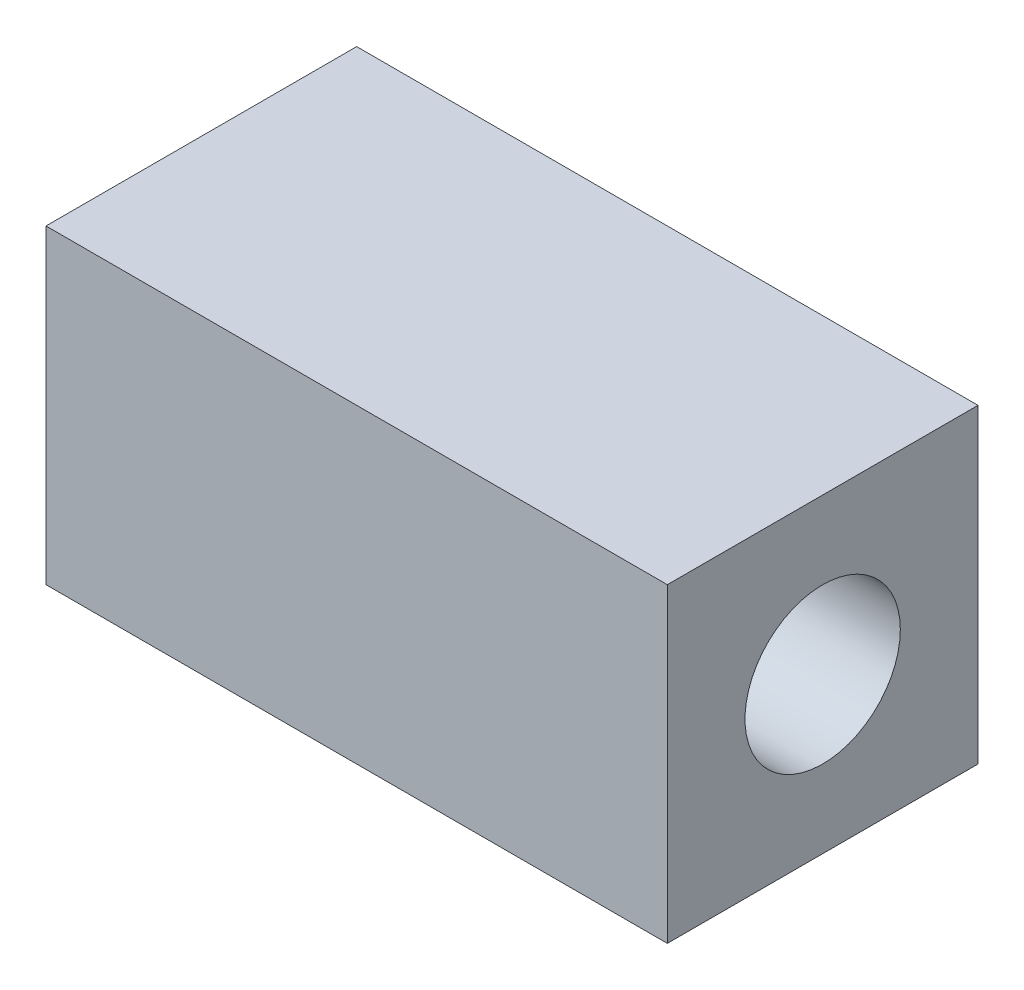
ISO-10303-21;
HEADER;
FILE_DESCRIPTION(('STEP AP214'),'2;1');
FILE_NAME('part.step','',(''),(''),'','','');
FILE_SCHEMA(('AUTOMOTIVE_DESIGN { 1 0 10303 214 1 1 1 1 }'));
ENDSEC;
DATA;
#1=APPLICATION_CONTEXT('core data for automotive mechanical design processes');
#2=APPLICATION_PROTOCOL_DEFINITION('international standard','automotive_design',2000,#1);
#3=PRODUCT_CONTEXT('',#1,'mechanical');
#4=PRODUCT('Part','Part','',(#3));
#5=PRODUCT_RELATED_PRODUCT_CATEGORY('part','',(#4));
#6=PRODUCT_DEFINITION_FORMATION('','',#4);
#7=PRODUCT_DEFINITION_CONTEXT('part definition',#1,'design');
#8=PRODUCT_DEFINITION('design','',#6,#7);
#9=PRODUCT_DEFINITION_SHAPE('','',#8);
#10=(LENGTH_UNIT() NAMED_UNIT(*) SI_UNIT(.MILLI.,.METRE.));
#11=(NAMED_UNIT(*) PLANE_ANGLE_UNIT() SI_UNIT($,.RADIAN.));
#12=(NAMED_UNIT(*) SI_UNIT($,.STERADIAN.) SOLID_ANGLE_UNIT());
#13=UNCERTAINTY_MEASURE_WITH_UNIT(LENGTH_MEASURE(1.E-05),#10,'distance_accuracy_value','');
#14=(GEOMETRIC_REPRESENTATION_CONTEXT(3) GLOBAL_UNCERTAINTY_ASSIGNED_CONTEXT((#13)) GLOBAL_UNIT_ASSIGNED_CONTEXT((#10,
#11,#12)) REPRESENTATION_CONTEXT('',''));
#15=CARTESIAN_POINT('',(0.,0.,0.));
#16=DIRECTION('',(0.,0.,1.));
#17=DIRECTION('',(1.,0.,0.));
#18=AXIS2_PLACEMENT_3D('',#15,#16,#17);
#19=CARTESIAN_POINT('',(40.,0.,0.));
#20=DIRECTION('',(-1.,0.,0.));
#21=DIRECTION('',(0.,0.,1.));
#22=AXIS2_PLACEMENT_3D('',#19,#20,#21);
#23=PLANE('',#22);
#24=DIRECTION('',(0.,-1.,0.));
#25=VECTOR('',#24,1.);
#26=CARTESIAN_POINT('',(40.,0.,0.));
#27=LINE('',#26,#25);
#28=CARTESIAN_POINT('',(40.,20.,0.));
#29=VERTEX_POINT('',#28);
#30=CARTESIAN_POINT('',(40.,0.,0.));
#31=VERTEX_POINT('',#30);
#32=EDGE_CURVE('E84',#29,#31,#27,.T.);
#33=ORIENTED_EDGE('',*,*,#32,.T.);
#34=DIRECTION('',(0.,0.,-1.));
#35=VECTOR('',#34,1.);
#36=CARTESIAN_POINT('',(40.,0.,0.));
#37=LINE('',#36,#35);
#38=CARTESIAN_POINT('',(40.,0.,-20.));
#39=VERTEX_POINT('',#38);
#40=EDGE_CURVE('E79',#31,#39,#37,.T.);
#41=ORIENTED_EDGE('',*,*,#40,.T.);
#42=DIRECTION('',(0.,1.,0.));
#43=VECTOR('',#42,1.);
#44=CARTESIAN_POINT('',(40.,0.,-20.));
#45=LINE('',#44,#43);
#46=CARTESIAN_POINT('',(40.,20.,-20.));
#47=VERTEX_POINT('',#46);
#48=EDGE_CURVE('E82',#39,#47,#45,.T.);
#49=ORIENTED_EDGE('',*,*,#48,.T.);
#50=DIRECTION('',(0.,0.,1.));
#51=VECTOR('',#50,1.);
#52=CARTESIAN_POINT('',(40.,20.,0.));
#53=LINE('',#52,#51);
#54=EDGE_CURVE('E49',#47,#29,#53,.T.);
#55=ORIENTED_EDGE('',*,*,#54,.T.);
#56=EDGE_LOOP('',(#33,#41,#49,#55));
#57=FACE_BOUND('',#56,.T.);
#58=CARTESIAN_POINT('',(40.,10.,-10.));
#59=DIRECTION('',(1.,0.,0.));
#60=DIRECTION('',(0.,0.,-1.));
#61=AXIS2_PLACEMENT_3D('',#58,#59,#60);
#62=CIRCLE('',#61,5.);
#63=CARTESIAN_POINT('',(40.,10.,-15.));
#64=VERTEX_POINT('',#63);
#65=EDGE_CURVE('E99',#64,#64,#62,.T.);
#66=ORIENTED_EDGE('',*,*,#65,.F.);
#67=EDGE_LOOP('',(#66));
#68=FACE_BOUND('',#67,.T.);
#69=ADVANCED_FACE('F32',(#57,#68),#23,.F.);
#70=CARTESIAN_POINT('',(0.,0.,0.));
#71=DIRECTION('',(-1.,0.,0.));
#72=DIRECTION('',(0.,0.,1.));
#73=AXIS2_PLACEMENT_3D('',#70,#71,#72);
#74=PLANE('',#73);
#75=DIRECTION('',(0.,-1.,0.));
#76=VECTOR('',#75,1.);
#77=CARTESIAN_POINT('',(0.,0.,0.));
#78=LINE('',#77,#76);
#79=CARTESIAN_POINT('',(0.,20.,0.));
#80=VERTEX_POINT('',#79);
#81=CARTESIAN_POINT('',(0.,0.,0.));
#82=VERTEX_POINT('',#81);
#83=EDGE_CURVE('E96',#80,#82,#78,.T.);
#84=ORIENTED_EDGE('',*,*,#83,.F.);
#85=DIRECTION('',(0.,0.,1.));
#86=VECTOR('',#85,1.);
#87=CARTESIAN_POINT('',(0.,20.,0.));
#88=LINE('',#87,#86);
#89=CARTESIAN_POINT('',(0.,20.,-20.));
#90=VERTEX_POINT('',#89);
#91=EDGE_CURVE('E72',#90,#80,#88,.T.);
#92=ORIENTED_EDGE('',*,*,#91,.F.);
#93=DIRECTION('',(0.,1.,0.));
#94=VECTOR('',#93,1.);
#95=CARTESIAN_POINT('',(0.,0.,-20.));
#96=LINE('',#95,#94);
#97=CARTESIAN_POINT('',(0.,0.,-20.));
#98=VERTEX_POINT('',#97);
#99=EDGE_CURVE('E66',#98,#90,#96,.T.);
#100=ORIENTED_EDGE('',*,*,#99,.F.);
#101=DIRECTION('',(0.,0.,-1.));
#102=VECTOR('',#101,1.);
#103=CARTESIAN_POINT('',(0.,0.,0.));
#104=LINE('',#103,#102);
#105=EDGE_CURVE('E88',#82,#98,#104,.T.);
#106=ORIENTED_EDGE('',*,*,#105,.F.);
#107=EDGE_LOOP('',(#84,#92,#100,#106));
#108=FACE_BOUND('',#107,.T.);
#109=CARTESIAN_POINT('',(0.,10.,-10.));
#110=DIRECTION('',(1.,0.,0.));
#111=DIRECTION('',(0.,0.,-1.));
#112=AXIS2_PLACEMENT_3D('',#109,#110,#111);
#113=CIRCLE('',#112,5.);
#114=CARTESIAN_POINT('',(0.,10.,-15.));
#115=VERTEX_POINT('',#114);
#116=EDGE_CURVE('E111',#115,#115,#113,.T.);
#117=ORIENTED_EDGE('',*,*,#116,.T.);
#118=EDGE_LOOP('',(#117));
#119=FACE_BOUND('',#118,.T.);
#120=ADVANCED_FACE('F107',(#108,#119),#74,.T.);
#121=CARTESIAN_POINT('',(40.,0.,0.));
#122=DIRECTION('',(0.,0.,-1.));
#123=DIRECTION('',(-1.,0.,0.));
#124=AXIS2_PLACEMENT_3D('',#121,#122,#123);
#125=PLANE('',#124);
#126=ORIENTED_EDGE('',*,*,#83,.T.);
#127=DIRECTION('',(-1.,0.,0.));
#128=VECTOR('',#127,1.);
#129=CARTESIAN_POINT('',(40.,0.,0.));
#130=LINE('',#129,#128);
#131=EDGE_CURVE('E11',#31,#82,#130,.T.);
#132=ORIENTED_EDGE('',*,*,#131,.F.);
#133=ORIENTED_EDGE('',*,*,#32,.F.);
#134=DIRECTION('',(-1.,0.,0.));
#135=VECTOR('',#134,1.);
#136=CARTESIAN_POINT('',(40.,20.,0.));
#137=LINE('',#136,#135);
#138=EDGE_CURVE('E92',#29,#80,#137,.T.);
#139=ORIENTED_EDGE('',*,*,#138,.T.);
#140=EDGE_LOOP('',(#126,#132,#133,#139));
#141=FACE_BOUND('',#140,.T.);
#142=ADVANCED_FACE('F34',(#141),#125,.F.);
#143=CARTESIAN_POINT('',(40.,0.,0.));
#144=DIRECTION('',(0.,1.,0.));
#145=DIRECTION('',(0.,0.,1.));
#146=AXIS2_PLACEMENT_3D('',#143,#144,#145);
#147=PLANE('',#146);
#148=ORIENTED_EDGE('',*,*,#105,.T.);
#149=DIRECTION('',(-1.,0.,0.));
#150=VECTOR('',#149,1.);
#151=CARTESIAN_POINT('',(40.,0.,-20.));
#152=LINE('',#151,#150);
#153=EDGE_CURVE('E41',#39,#98,#152,.T.);
#154=ORIENTED_EDGE('',*,*,#153,.F.);
#155=ORIENTED_EDGE('',*,*,#40,.F.);
#156=ORIENTED_EDGE('',*,*,#131,.T.);
#157=EDGE_LOOP('',(#148,#154,#155,#156));
#158=FACE_BOUND('',#157,.T.);
#159=ADVANCED_FACE('F87',(#158),#147,.F.);
#160=CARTESIAN_POINT('',(40.,0.,-20.));
#161=DIRECTION('',(0.,0.,1.));
#162=DIRECTION('',(1.,0.,0.));
#163=AXIS2_PLACEMENT_3D('',#160,#161,#162);
#164=PLANE('',#163);
#165=ORIENTED_EDGE('',*,*,#99,.T.);
#166=DIRECTION('',(-1.,0.,0.));
#167=VECTOR('',#166,1.);
#168=CARTESIAN_POINT('',(40.,20.,-20.));
#169=LINE('',#168,#167);
#170=EDGE_CURVE('E89',#47,#90,#169,.T.);
#171=ORIENTED_EDGE('',*,*,#170,.F.);
#172=ORIENTED_EDGE('',*,*,#48,.F.);
#173=ORIENTED_EDGE('',*,*,#153,.T.);
#174=EDGE_LOOP('',(#165,#171,#172,#173));
#175=FACE_BOUND('',#174,.T.);
#176=ADVANCED_FACE('F90',(#175),#164,.F.);
#177=CARTESIAN_POINT('',(40.,20.,0.));
#178=DIRECTION('',(0.,-1.,0.));
#179=DIRECTION('',(0.,0.,-1.));
#180=AXIS2_PLACEMENT_3D('',#177,#178,#179);
#181=PLANE('',#180);
#182=ORIENTED_EDGE('',*,*,#91,.T.);
#183=ORIENTED_EDGE('',*,*,#138,.F.);
#184=ORIENTED_EDGE('',*,*,#54,.F.);
#185=ORIENTED_EDGE('',*,*,#170,.T.);
#186=EDGE_LOOP('',(#182,#183,#184,#185));
#187=FACE_BOUND('',#186,.T.);
#188=ADVANCED_FACE('F104',(#187),#181,.F.);
#189=CARTESIAN_POINT('',(40.,10.,-10.));
#190=DIRECTION('',(-1.,0.,0.));
#191=DIRECTION('',(0.,0.,1.));
#192=AXIS2_PLACEMENT_3D('',#189,#190,#191);
#193=CYLINDRICAL_SURFACE('',#192,5.);
#194=ORIENTED_EDGE('',*,*,#65,.T.);
#195=EDGE_LOOP('',(#194));
#196=FACE_BOUND('',#195,.T.);
#197=ORIENTED_EDGE('',*,*,#116,.F.);
#198=EDGE_LOOP('',(#197));
#199=FACE_BOUND('',#198,.T.);
#200=ADVANCED_FACE('F117',(#196,#199),#193,.F.);
#201=CLOSED_SHELL('',(#69,#120,#142,#159,#176,#188,#200));
#202=MANIFOLD_SOLID_BREP('B2',#201);
#203=ADVANCED_BREP_SHAPE_REPRESENTATION('',(#18,#202),#14);
#204=SHAPE_DEFINITION_REPRESENTATION(#9,#203);
ENDSEC;
END-ISO-10303-21;
